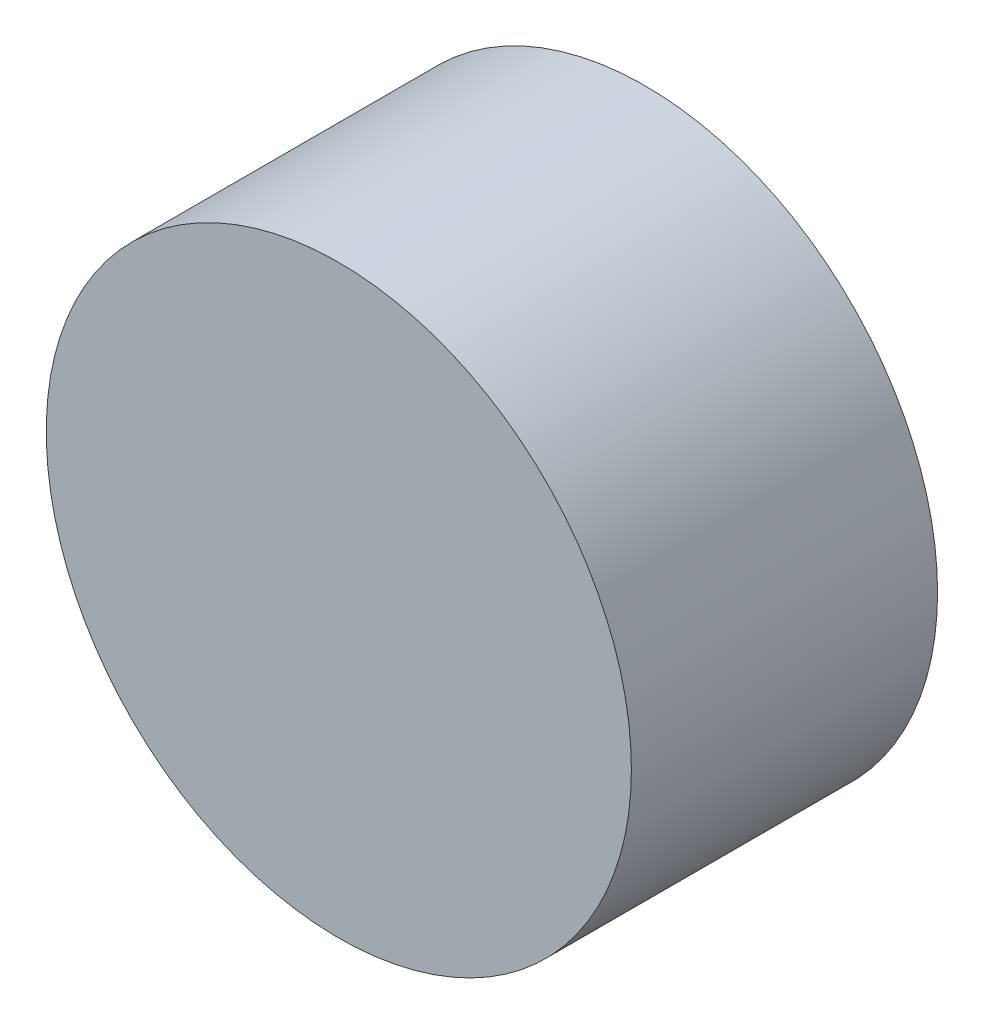
ISO-10303-21;
HEADER;
FILE_DESCRIPTION(('STEP AP214'),'2;1');
FILE_NAME('part.step','',(''),(''),'','','');
FILE_SCHEMA(('AUTOMOTIVE_DESIGN { 1 0 10303 214 1 1 1 1 }'));
ENDSEC;
DATA;
#1=APPLICATION_CONTEXT('core data for automotive mechanical design processes');
#2=APPLICATION_PROTOCOL_DEFINITION('international standard','automotive_design',2000,#1);
#3=PRODUCT_CONTEXT('',#1,'mechanical');
#4=PRODUCT('Part','Part','',(#3));
#5=PRODUCT_RELATED_PRODUCT_CATEGORY('part','',(#4));
#6=PRODUCT_DEFINITION_FORMATION('','',#4);
#7=PRODUCT_DEFINITION_CONTEXT('part definition',#1,'design');
#8=PRODUCT_DEFINITION('design','',#6,#7);
#9=PRODUCT_DEFINITION_SHAPE('','',#8);
#10=(LENGTH_UNIT() NAMED_UNIT(*) SI_UNIT(.MILLI.,.METRE.));
#11=(NAMED_UNIT(*) PLANE_ANGLE_UNIT() SI_UNIT($,.RADIAN.));
#12=(NAMED_UNIT(*) SI_UNIT($,.STERADIAN.) SOLID_ANGLE_UNIT());
#13=UNCERTAINTY_MEASURE_WITH_UNIT(LENGTH_MEASURE(1.E-05),#10,'distance_accuracy_value','');
#14=(GEOMETRIC_REPRESENTATION_CONTEXT(3) GLOBAL_UNCERTAINTY_ASSIGNED_CONTEXT((#13)) GLOBAL_UNIT_ASSIGNED_CONTEXT((#10,
#11,#12)) REPRESENTATION_CONTEXT('',''));
#15=CARTESIAN_POINT('',(0.,0.,0.));
#16=DIRECTION('',(0.,0.,1.));
#17=DIRECTION('',(1.,0.,0.));
#18=AXIS2_PLACEMENT_3D('',#15,#16,#17);
#19=CARTESIAN_POINT('',(0.,0.,40.));
#20=DIRECTION('',(0.,0.,1.));
#21=DIRECTION('',(1.,0.,0.));
#22=AXIS2_PLACEMENT_3D('',#19,#20,#21);
#23=PLANE('',#22);
#24=CARTESIAN_POINT('',(0.,0.,40.));
#25=DIRECTION('',(0.,0.,1.));
#26=DIRECTION('',(1.,0.,0.));
#27=AXIS2_PLACEMENT_3D('',#24,#25,#26);
#28=CIRCLE('',#27,27.5);
#29=CARTESIAN_POINT('',(27.5,0.,40.));
#30=VERTEX_POINT('',#29);
#31=EDGE_CURVE('E228',#30,#30,#28,.T.);
#32=ORIENTED_EDGE('',*,*,#31,.F.);
#33=EDGE_LOOP('',(#32));
#34=FACE_BOUND('',#33,.T.);
#35=DIRECTION('',(0.5,0.866025403784439,0.));
#36=VECTOR('',#35,1.);
#37=CARTESIAN_POINT('',(-12.7017059221718,0.,40.));
#38=LINE('',#37,#36);
#39=CARTESIAN_POINT('',(-12.7017059221718,0.,40.));
#40=VERTEX_POINT('',#39);
#41=CARTESIAN_POINT('',(-6.35085296108589,11.,40.));
#42=VERTEX_POINT('',#41);
#43=EDGE_CURVE('E143',#40,#42,#38,.T.);
#44=ORIENTED_EDGE('',*,*,#43,.F.);
#45=DIRECTION('',(-0.5,0.866025403784439,0.));
#46=VECTOR('',#45,1.);
#47=CARTESIAN_POINT('',(-6.35085296108589,-11.,40.));
#48=LINE('',#47,#46);
#49=CARTESIAN_POINT('',(-6.35085296108589,-11.,40.));
#50=VERTEX_POINT('',#49);
#51=EDGE_CURVE('E186',#50,#40,#48,.T.);
#52=ORIENTED_EDGE('',*,*,#51,.F.);
#53=DIRECTION('',(-1.,0.,0.));
#54=VECTOR('',#53,1.);
#55=CARTESIAN_POINT('',(6.35085296108586,-11.,40.));
#56=LINE('',#55,#54);
#57=CARTESIAN_POINT('',(6.35085296108586,-11.,40.));
#58=VERTEX_POINT('',#57);
#59=EDGE_CURVE('E204',#58,#50,#56,.T.);
#60=ORIENTED_EDGE('',*,*,#59,.F.);
#61=DIRECTION('',(-0.5,-0.866025403784438,0.));
#62=VECTOR('',#61,1.);
#63=CARTESIAN_POINT('',(12.7017059221718,0.,40.));
#64=LINE('',#63,#62);
#65=CARTESIAN_POINT('',(12.7017059221718,0.,40.));
#66=VERTEX_POINT('',#65);
#67=EDGE_CURVE('E201',#66,#58,#64,.T.);
#68=ORIENTED_EDGE('',*,*,#67,.F.);
#69=DIRECTION('',(0.5,-0.866025403784439,0.));
#70=VECTOR('',#69,1.);
#71=CARTESIAN_POINT('',(6.35085296108587,11.,40.));
#72=LINE('',#71,#70);
#73=CARTESIAN_POINT('',(6.35085296108587,11.,40.));
#74=VERTEX_POINT('',#73);
#75=EDGE_CURVE('E57',#74,#66,#72,.T.);
#76=ORIENTED_EDGE('',*,*,#75,.F.);
#77=DIRECTION('',(1.,0.,0.));
#78=VECTOR('',#77,1.);
#79=CARTESIAN_POINT('',(-6.35085296108589,11.,40.));
#80=LINE('',#79,#78);
#81=EDGE_CURVE('E52',#42,#74,#80,.T.);
#82=ORIENTED_EDGE('',*,*,#81,.F.);
#83=EDGE_LOOP('',(#44,#52,#60,#68,#76,#82));
#84=FACE_BOUND('',#83,.T.);
#85=ADVANCED_FACE('F37',(#34,#84),#23,.F.);
#86=CARTESIAN_POINT('',(0.,0.,0.));
#87=DIRECTION('',(0.,0.,1.));
#88=DIRECTION('',(1.,0.,0.));
#89=AXIS2_PLACEMENT_3D('',#86,#87,#88);
#90=PLANE('',#89);
#91=CARTESIAN_POINT('',(0.,0.,0.));
#92=DIRECTION('',(0.,0.,1.));
#93=DIRECTION('',(1.,0.,0.));
#94=AXIS2_PLACEMENT_3D('',#91,#92,#93);
#95=CIRCLE('',#94,43.);
#96=CARTESIAN_POINT('',(43.,0.,0.));
#97=VERTEX_POINT('',#96);
#98=EDGE_CURVE('E11',#97,#97,#95,.T.);
#99=ORIENTED_EDGE('',*,*,#98,.F.);
#100=EDGE_LOOP('',(#99));
#101=FACE_BOUND('',#100,.T.);
#102=CARTESIAN_POINT('',(0.,0.,0.));
#103=DIRECTION('',(0.,0.,1.));
#104=DIRECTION('',(1.,0.,0.));
#105=AXIS2_PLACEMENT_3D('',#102,#103,#104);
#106=CIRCLE('',#105,27.5);
#107=CARTESIAN_POINT('',(27.5,0.,0.));
#108=VERTEX_POINT('',#107);
#109=EDGE_CURVE('E45',#108,#108,#106,.T.);
#110=ORIENTED_EDGE('',*,*,#109,.T.);
#111=EDGE_LOOP('',(#110));
#112=FACE_BOUND('',#111,.T.);
#113=ADVANCED_FACE('F233',(#101,#112),#90,.F.);
#114=CARTESIAN_POINT('',(0.,0.,40.));
#115=DIRECTION('',(0.,0.,-1.));
#116=DIRECTION('',(-1.,0.,0.));
#117=AXIS2_PLACEMENT_3D('',#114,#115,#116);
#118=CYLINDRICAL_SURFACE('',#117,43.);
#119=ORIENTED_EDGE('',*,*,#98,.T.);
#120=EDGE_LOOP('',(#119));
#121=FACE_BOUND('',#120,.T.);
#122=CARTESIAN_POINT('',(0.,0.,45.));
#123=DIRECTION('',(0.,0.,1.));
#124=DIRECTION('',(1.,0.,0.));
#125=AXIS2_PLACEMENT_3D('',#122,#123,#124);
#126=CIRCLE('',#125,43.);
#127=CARTESIAN_POINT('',(43.,0.,45.));
#128=VERTEX_POINT('',#127);
#129=EDGE_CURVE('E225',#128,#128,#126,.T.);
#130=ORIENTED_EDGE('',*,*,#129,.F.);
#131=EDGE_LOOP('',(#130));
#132=FACE_BOUND('',#131,.T.);
#133=ADVANCED_FACE('F39',(#121,#132),#118,.T.);
#134=CARTESIAN_POINT('',(0.,0.,40.));
#135=DIRECTION('',(0.,0.,-1.));
#136=DIRECTION('',(-1.,0.,0.));
#137=AXIS2_PLACEMENT_3D('',#134,#135,#136);
#138=CYLINDRICAL_SURFACE('',#137,27.5);
#139=ORIENTED_EDGE('',*,*,#31,.T.);
#140=EDGE_LOOP('',(#139));
#141=FACE_BOUND('',#140,.T.);
#142=ORIENTED_EDGE('',*,*,#109,.F.);
#143=EDGE_LOOP('',(#142));
#144=FACE_BOUND('',#143,.T.);
#145=ADVANCED_FACE('F235',(#141,#144),#138,.F.);
#146=CARTESIAN_POINT('',(0.,0.,45.));
#147=DIRECTION('',(0.,0.,1.));
#148=DIRECTION('',(1.,0.,0.));
#149=AXIS2_PLACEMENT_3D('',#146,#147,#148);
#150=PLANE('',#149);
#151=ORIENTED_EDGE('',*,*,#129,.T.);
#152=EDGE_LOOP('',(#151));
#153=FACE_BOUND('',#152,.T.);
#154=ADVANCED_FACE('F237',(#153),#150,.T.);
#155=CARTESIAN_POINT('',(0.,0.,30.));
#156=DIRECTION('',(0.,0.,-1.));
#157=DIRECTION('',(-1.,0.,0.));
#158=AXIS2_PLACEMENT_3D('',#155,#156,#157);
#159=PLANE('',#158);
#160=DIRECTION('',(0.5,0.866025403784439,0.));
#161=VECTOR('',#160,1.);
#162=CARTESIAN_POINT('',(-12.7017059221718,0.,30.));
#163=LINE('',#162,#161);
#164=CARTESIAN_POINT('',(-12.7017059221718,0.,30.));
#165=VERTEX_POINT('',#164);
#166=CARTESIAN_POINT('',(-6.35085296108589,11.,30.));
#167=VERTEX_POINT('',#166);
#168=EDGE_CURVE('E182',#165,#167,#163,.T.);
#169=ORIENTED_EDGE('',*,*,#168,.T.);
#170=DIRECTION('',(1.,0.,0.));
#171=VECTOR('',#170,1.);
#172=CARTESIAN_POINT('',(-6.35085296108589,11.,30.));
#173=LINE('',#172,#171);
#174=CARTESIAN_POINT('',(6.35085296108587,11.,30.));
#175=VERTEX_POINT('',#174);
#176=EDGE_CURVE('E185',#167,#175,#173,.T.);
#177=ORIENTED_EDGE('',*,*,#176,.T.);
#178=DIRECTION('',(0.5,-0.866025403784439,0.));
#179=VECTOR('',#178,1.);
#180=CARTESIAN_POINT('',(6.35085296108587,11.,30.));
#181=LINE('',#180,#179);
#182=CARTESIAN_POINT('',(12.7017059221718,0.,30.));
#183=VERTEX_POINT('',#182);
#184=EDGE_CURVE('E188',#175,#183,#181,.T.);
#185=ORIENTED_EDGE('',*,*,#184,.T.);
#186=DIRECTION('',(-0.5,-0.866025403784438,0.));
#187=VECTOR('',#186,1.);
#188=CARTESIAN_POINT('',(12.7017059221718,0.,30.));
#189=LINE('',#188,#187);
#190=CARTESIAN_POINT('',(6.35085296108586,-11.,30.));
#191=VERTEX_POINT('',#190);
#192=EDGE_CURVE('E190',#183,#191,#189,.T.);
#193=ORIENTED_EDGE('',*,*,#192,.T.);
#194=DIRECTION('',(-1.,0.,0.));
#195=VECTOR('',#194,1.);
#196=CARTESIAN_POINT('',(6.35085296108586,-11.,30.));
#197=LINE('',#196,#195);
#198=CARTESIAN_POINT('',(-6.35085296108589,-11.,30.));
#199=VERTEX_POINT('',#198);
#200=EDGE_CURVE('E192',#191,#199,#197,.T.);
#201=ORIENTED_EDGE('',*,*,#200,.T.);
#202=DIRECTION('',(-0.5,0.866025403784439,0.));
#203=VECTOR('',#202,1.);
#204=CARTESIAN_POINT('',(-6.35085296108589,-11.,30.));
#205=LINE('',#204,#203);
#206=EDGE_CURVE('E194',#199,#165,#205,.T.);
#207=ORIENTED_EDGE('',*,*,#206,.T.);
#208=EDGE_LOOP('',(#169,#177,#185,#193,#201,#207));
#209=FACE_BOUND('',#208,.T.);
#210=DIRECTION('',(1.,0.,0.));
#211=VECTOR('',#210,1.);
#212=CARTESIAN_POINT('',(-3.46410161513775,6.,30.));
#213=LINE('',#212,#211);
#214=CARTESIAN_POINT('',(-3.46410161513775,6.,30.));
#215=VERTEX_POINT('',#214);
#216=CARTESIAN_POINT('',(3.46410161513776,6.,30.));
#217=VERTEX_POINT('',#216);
#218=EDGE_CURVE('E135',#215,#217,#213,.T.);
#219=ORIENTED_EDGE('',*,*,#218,.F.);
#220=DIRECTION('',(0.5,0.866025403784438,0.));
#221=VECTOR('',#220,1.);
#222=CARTESIAN_POINT('',(-6.92820323027551,0.,30.));
#223=LINE('',#222,#221);
#224=CARTESIAN_POINT('',(-6.92820323027551,0.,30.));
#225=VERTEX_POINT('',#224);
#226=EDGE_CURVE('E125',#225,#215,#223,.T.);
#227=ORIENTED_EDGE('',*,*,#226,.F.);
#228=DIRECTION('',(-0.5,0.866025403784439,0.));
#229=VECTOR('',#228,1.);
#230=CARTESIAN_POINT('',(-3.46410161513775,-6.,30.));
#231=LINE('',#230,#229);
#232=CARTESIAN_POINT('',(-3.46410161513775,-6.,30.));
#233=VERTEX_POINT('',#232);
#234=EDGE_CURVE('E158',#233,#225,#231,.T.);
#235=ORIENTED_EDGE('',*,*,#234,.F.);
#236=DIRECTION('',(-1.,0.,0.));
#237=VECTOR('',#236,1.);
#238=CARTESIAN_POINT('',(3.46410161513776,-6.,30.));
#239=LINE('',#238,#237);
#240=CARTESIAN_POINT('',(3.46410161513776,-6.,30.));
#241=VERTEX_POINT('',#240);
#242=EDGE_CURVE('E155',#241,#233,#239,.T.);
#243=ORIENTED_EDGE('',*,*,#242,.F.);
#244=DIRECTION('',(-0.5,-0.866025403784438,0.));
#245=VECTOR('',#244,1.);
#246=CARTESIAN_POINT('',(6.92820323027551,0.,30.));
#247=LINE('',#246,#245);
#248=CARTESIAN_POINT('',(6.92820323027551,0.,30.));
#249=VERTEX_POINT('',#248);
#250=EDGE_CURVE('E151',#249,#241,#247,.T.);
#251=ORIENTED_EDGE('',*,*,#250,.F.);
#252=DIRECTION('',(0.5,-0.866025403784439,0.));
#253=VECTOR('',#252,1.);
#254=CARTESIAN_POINT('',(3.46410161513776,6.,30.));
#255=LINE('',#254,#253);
#256=EDGE_CURVE('E149',#217,#249,#255,.T.);
#257=ORIENTED_EDGE('',*,*,#256,.F.);
#258=EDGE_LOOP('',(#219,#227,#235,#243,#251,#257));
#259=FACE_BOUND('',#258,.T.);
#260=ADVANCED_FACE('F147',(#209,#259),#159,.T.);
#261=CARTESIAN_POINT('',(-12.7017059221718,0.,30.));
#262=DIRECTION('',(0.866025403784439,-0.5,0.));
#263=DIRECTION('',(0.5,0.866025403784439,0.));
#264=AXIS2_PLACEMENT_3D('',#261,#262,#263);
#265=PLANE('',#264);
#266=ORIENTED_EDGE('',*,*,#43,.T.);
#267=DIRECTION('',(0.,0.,1.));
#268=VECTOR('',#267,1.);
#269=CARTESIAN_POINT('',(-6.35085296108589,11.,30.));
#270=LINE('',#269,#268);
#271=EDGE_CURVE('E223',#167,#42,#270,.T.);
#272=ORIENTED_EDGE('',*,*,#271,.F.);
#273=ORIENTED_EDGE('',*,*,#168,.F.);
#274=DIRECTION('',(0.,0.,1.));
#275=VECTOR('',#274,1.);
#276=CARTESIAN_POINT('',(-12.7017059221718,0.,30.));
#277=LINE('',#276,#275);
#278=EDGE_CURVE('E196',#165,#40,#277,.T.);
#279=ORIENTED_EDGE('',*,*,#278,.T.);
#280=EDGE_LOOP('',(#266,#272,#273,#279));
#281=FACE_BOUND('',#280,.T.);
#282=ADVANCED_FACE('F292',(#281),#265,.F.);
#283=CARTESIAN_POINT('',(-6.35085296108589,11.,30.));
#284=DIRECTION('',(0.,-1.,0.));
#285=DIRECTION('',(1.,0.,0.));
#286=AXIS2_PLACEMENT_3D('',#283,#284,#285);
#287=PLANE('',#286);
#288=ORIENTED_EDGE('',*,*,#81,.T.);
#289=DIRECTION('',(0.,0.,1.));
#290=VECTOR('',#289,1.);
#291=CARTESIAN_POINT('',(6.35085296108587,11.,30.));
#292=LINE('',#291,#290);
#293=EDGE_CURVE('E220',#175,#74,#292,.T.);
#294=ORIENTED_EDGE('',*,*,#293,.F.);
#295=ORIENTED_EDGE('',*,*,#176,.F.);
#296=ORIENTED_EDGE('',*,*,#271,.T.);
#297=EDGE_LOOP('',(#288,#294,#295,#296));
#298=FACE_BOUND('',#297,.T.);
#299=ADVANCED_FACE('F308',(#298),#287,.F.);
#300=CARTESIAN_POINT('',(6.35085296108587,11.,30.));
#301=DIRECTION('',(-0.866025403784439,-0.5,0.));
#302=DIRECTION('',(0.5,-0.866025403784439,0.));
#303=AXIS2_PLACEMENT_3D('',#300,#301,#302);
#304=PLANE('',#303);
#305=ORIENTED_EDGE('',*,*,#75,.T.);
#306=DIRECTION('',(0.,0.,1.));
#307=VECTOR('',#306,1.);
#308=CARTESIAN_POINT('',(12.7017059221718,0.,30.));
#309=LINE('',#308,#307);
#310=EDGE_CURVE('E217',#183,#66,#309,.T.);
#311=ORIENTED_EDGE('',*,*,#310,.F.);
#312=ORIENTED_EDGE('',*,*,#184,.F.);
#313=ORIENTED_EDGE('',*,*,#293,.T.);
#314=EDGE_LOOP('',(#305,#311,#312,#313));
#315=FACE_BOUND('',#314,.T.);
#316=ADVANCED_FACE('F304',(#315),#304,.F.);
#317=CARTESIAN_POINT('',(12.7017059221718,0.,30.));
#318=DIRECTION('',(-0.866025403784439,0.5,0.));
#319=DIRECTION('',(-0.5,-0.866025403784439,0.));
#320=AXIS2_PLACEMENT_3D('',#317,#318,#319);
#321=PLANE('',#320);
#322=ORIENTED_EDGE('',*,*,#67,.T.);
#323=DIRECTION('',(0.,0.,1.));
#324=VECTOR('',#323,1.);
#325=CARTESIAN_POINT('',(6.35085296108586,-11.,30.));
#326=LINE('',#325,#324);
#327=EDGE_CURVE('E214',#191,#58,#326,.T.);
#328=ORIENTED_EDGE('',*,*,#327,.F.);
#329=ORIENTED_EDGE('',*,*,#192,.F.);
#330=ORIENTED_EDGE('',*,*,#310,.T.);
#331=EDGE_LOOP('',(#322,#328,#329,#330));
#332=FACE_BOUND('',#331,.T.);
#333=ADVANCED_FACE('F300',(#332),#321,.F.);
#334=CARTESIAN_POINT('',(6.35085296108586,-11.,30.));
#335=DIRECTION('',(0.,1.,0.));
#336=DIRECTION('',(0.,0.,1.));
#337=AXIS2_PLACEMENT_3D('',#334,#335,#336);
#338=PLANE('',#337);
#339=ORIENTED_EDGE('',*,*,#59,.T.);
#340=DIRECTION('',(0.,0.,1.));
#341=VECTOR('',#340,1.);
#342=CARTESIAN_POINT('',(-6.35085296108589,-11.,30.));
#343=LINE('',#342,#341);
#344=EDGE_CURVE('E211',#199,#50,#343,.T.);
#345=ORIENTED_EDGE('',*,*,#344,.F.);
#346=ORIENTED_EDGE('',*,*,#200,.F.);
#347=ORIENTED_EDGE('',*,*,#327,.T.);
#348=EDGE_LOOP('',(#339,#345,#346,#347));
#349=FACE_BOUND('',#348,.T.);
#350=ADVANCED_FACE('F296',(#349),#338,.F.);
#351=CARTESIAN_POINT('',(-6.35085296108589,-11.,30.));
#352=DIRECTION('',(0.866025403784439,0.5,0.));
#353=DIRECTION('',(-0.5,0.866025403784439,0.));
#354=AXIS2_PLACEMENT_3D('',#351,#352,#353);
#355=PLANE('',#354);
#356=ORIENTED_EDGE('',*,*,#51,.T.);
#357=ORIENTED_EDGE('',*,*,#278,.F.);
#358=ORIENTED_EDGE('',*,*,#206,.F.);
#359=ORIENTED_EDGE('',*,*,#344,.T.);
#360=EDGE_LOOP('',(#356,#357,#358,#359));
#361=FACE_BOUND('',#360,.T.);
#362=ADVANCED_FACE('F289',(#361),#355,.F.);
#363=CARTESIAN_POINT('',(-6.92820323027551,0.,30.));
#364=DIRECTION('',(0.866025403784438,-0.5,0.));
#365=DIRECTION('',(0.5,0.866025403784438,0.));
#366=AXIS2_PLACEMENT_3D('',#363,#364,#365);
#367=PLANE('',#366);
#368=DIRECTION('',(0.5,0.866025403784438,0.));
#369=VECTOR('',#368,1.);
#370=CARTESIAN_POINT('',(-6.92820323027551,0.,40.));
#371=LINE('',#370,#369);
#372=CARTESIAN_POINT('',(-6.92820323027551,0.,40.));
#373=VERTEX_POINT('',#372);
#374=CARTESIAN_POINT('',(-3.46410161513775,6.,40.));
#375=VERTEX_POINT('',#374);
#376=EDGE_CURVE('E160',#373,#375,#371,.T.);
#377=ORIENTED_EDGE('',*,*,#376,.F.);
#378=DIRECTION('',(0.,0.,1.));
#379=VECTOR('',#378,1.);
#380=CARTESIAN_POINT('',(-6.92820323027551,0.,30.));
#381=LINE('',#380,#379);
#382=EDGE_CURVE('E131',#225,#373,#381,.T.);
#383=ORIENTED_EDGE('',*,*,#382,.F.);
#384=ORIENTED_EDGE('',*,*,#226,.T.);
#385=DIRECTION('',(0.,0.,1.));
#386=VECTOR('',#385,1.);
#387=CARTESIAN_POINT('',(-3.46410161513775,6.,30.));
#388=LINE('',#387,#386);
#389=EDGE_CURVE('E129',#215,#375,#388,.T.);
#390=ORIENTED_EDGE('',*,*,#389,.T.);
#391=EDGE_LOOP('',(#377,#383,#384,#390));
#392=FACE_BOUND('',#391,.T.);
#393=ADVANCED_FACE('F128',(#392),#367,.T.);
#394=CARTESIAN_POINT('',(-3.46410161513775,6.,30.));
#395=DIRECTION('',(0.,-1.,0.));
#396=DIRECTION('',(0.,0.,-1.));
#397=AXIS2_PLACEMENT_3D('',#394,#395,#396);
#398=PLANE('',#397);
#399=DIRECTION('',(1.,0.,0.));
#400=VECTOR('',#399,1.);
#401=CARTESIAN_POINT('',(-3.46410161513775,6.,40.));
#402=LINE('',#401,#400);
#403=CARTESIAN_POINT('',(3.46410161513776,6.,40.));
#404=VERTEX_POINT('',#403);
#405=EDGE_CURVE('E142',#375,#404,#402,.T.);
#406=ORIENTED_EDGE('',*,*,#405,.F.);
#407=ORIENTED_EDGE('',*,*,#389,.F.);
#408=ORIENTED_EDGE('',*,*,#218,.T.);
#409=DIRECTION('',(0.,0.,1.));
#410=VECTOR('',#409,1.);
#411=CARTESIAN_POINT('',(3.46410161513776,6.,30.));
#412=LINE('',#411,#410);
#413=EDGE_CURVE('E144',#217,#404,#412,.T.);
#414=ORIENTED_EDGE('',*,*,#413,.T.);
#415=EDGE_LOOP('',(#406,#407,#408,#414));
#416=FACE_BOUND('',#415,.T.);
#417=ADVANCED_FACE('F139',(#416),#398,.T.);
#418=CARTESIAN_POINT('',(3.46410161513776,6.,30.));
#419=DIRECTION('',(-0.866025403784439,-0.5,0.));
#420=DIRECTION('',(0.5,-0.866025403784439,0.));
#421=AXIS2_PLACEMENT_3D('',#418,#419,#420);
#422=PLANE('',#421);
#423=DIRECTION('',(0.5,-0.866025403784439,0.));
#424=VECTOR('',#423,1.);
#425=CARTESIAN_POINT('',(3.46410161513776,6.,40.));
#426=LINE('',#425,#424);
#427=CARTESIAN_POINT('',(6.92820323027551,0.,40.));
#428=VERTEX_POINT('',#427);
#429=EDGE_CURVE('E163',#404,#428,#426,.T.);
#430=ORIENTED_EDGE('',*,*,#429,.F.);
#431=ORIENTED_EDGE('',*,*,#413,.F.);
#432=ORIENTED_EDGE('',*,*,#256,.T.);
#433=DIRECTION('',(0.,0.,1.));
#434=VECTOR('',#433,1.);
#435=CARTESIAN_POINT('',(6.92820323027551,0.,30.));
#436=LINE('',#435,#434);
#437=EDGE_CURVE('E179',#249,#428,#436,.T.);
#438=ORIENTED_EDGE('',*,*,#437,.T.);
#439=EDGE_LOOP('',(#430,#431,#432,#438));
#440=FACE_BOUND('',#439,.T.);
#441=ADVANCED_FACE('F276',(#440),#422,.T.);
#442=CARTESIAN_POINT('',(6.92820323027551,0.,30.));
#443=DIRECTION('',(-0.866025403784438,0.5,0.));
#444=DIRECTION('',(-0.5,-0.866025403784439,0.));
#445=AXIS2_PLACEMENT_3D('',#442,#443,#444);
#446=PLANE('',#445);
#447=DIRECTION('',(-0.5,-0.866025403784438,0.));
#448=VECTOR('',#447,1.);
#449=CARTESIAN_POINT('',(6.92820323027551,0.,40.));
#450=LINE('',#449,#448);
#451=CARTESIAN_POINT('',(3.46410161513776,-6.,40.));
#452=VERTEX_POINT('',#451);
#453=EDGE_CURVE('E166',#428,#452,#450,.T.);
#454=ORIENTED_EDGE('',*,*,#453,.F.);
#455=ORIENTED_EDGE('',*,*,#437,.F.);
#456=ORIENTED_EDGE('',*,*,#250,.T.);
#457=DIRECTION('',(0.,0.,1.));
#458=VECTOR('',#457,1.);
#459=CARTESIAN_POINT('',(3.46410161513776,-6.,30.));
#460=LINE('',#459,#458);
#461=EDGE_CURVE('E177',#241,#452,#460,.T.);
#462=ORIENTED_EDGE('',*,*,#461,.T.);
#463=EDGE_LOOP('',(#454,#455,#456,#462));
#464=FACE_BOUND('',#463,.T.);
#465=ADVANCED_FACE('F272',(#464),#446,.T.);
#466=CARTESIAN_POINT('',(3.46410161513776,-6.,30.));
#467=DIRECTION('',(0.,1.,0.));
#468=DIRECTION('',(0.,0.,1.));
#469=AXIS2_PLACEMENT_3D('',#466,#467,#468);
#470=PLANE('',#469);
#471=DIRECTION('',(-1.,0.,0.));
#472=VECTOR('',#471,1.);
#473=CARTESIAN_POINT('',(3.46410161513776,-6.,40.));
#474=LINE('',#473,#472);
#475=CARTESIAN_POINT('',(-3.46410161513775,-6.,40.));
#476=VERTEX_POINT('',#475);
#477=EDGE_CURVE('E169',#452,#476,#474,.T.);
#478=ORIENTED_EDGE('',*,*,#477,.F.);
#479=ORIENTED_EDGE('',*,*,#461,.F.);
#480=ORIENTED_EDGE('',*,*,#242,.T.);
#481=DIRECTION('',(0.,0.,1.));
#482=VECTOR('',#481,1.);
#483=CARTESIAN_POINT('',(-3.46410161513775,-6.,30.));
#484=LINE('',#483,#482);
#485=EDGE_CURVE('E175',#233,#476,#484,.T.);
#486=ORIENTED_EDGE('',*,*,#485,.T.);
#487=EDGE_LOOP('',(#478,#479,#480,#486));
#488=FACE_BOUND('',#487,.T.);
#489=ADVANCED_FACE('F262',(#488),#470,.T.);
#490=CARTESIAN_POINT('',(-3.46410161513775,-6.,30.));
#491=DIRECTION('',(0.866025403784439,0.5,0.));
#492=DIRECTION('',(-0.5,0.866025403784439,0.));
#493=AXIS2_PLACEMENT_3D('',#490,#491,#492);
#494=PLANE('',#493);
#495=DIRECTION('',(-0.5,0.866025403784439,0.));
#496=VECTOR('',#495,1.);
#497=CARTESIAN_POINT('',(-3.46410161513775,-6.,40.));
#498=LINE('',#497,#496);
#499=EDGE_CURVE('E136',#476,#373,#498,.T.);
#500=ORIENTED_EDGE('',*,*,#499,.F.);
#501=ORIENTED_EDGE('',*,*,#485,.F.);
#502=ORIENTED_EDGE('',*,*,#234,.T.);
#503=ORIENTED_EDGE('',*,*,#382,.T.);
#504=EDGE_LOOP('',(#500,#501,#502,#503));
#505=FACE_BOUND('',#504,.T.);
#506=ADVANCED_FACE('F257',(#505),#494,.T.);
#507=ORIENTED_EDGE('',*,*,#499,.T.);
#508=ORIENTED_EDGE('',*,*,#376,.T.);
#509=ORIENTED_EDGE('',*,*,#405,.T.);
#510=ORIENTED_EDGE('',*,*,#429,.T.);
#511=ORIENTED_EDGE('',*,*,#453,.T.);
#512=ORIENTED_EDGE('',*,*,#477,.T.);
#513=EDGE_LOOP('',(#507,#508,#509,#510,#511,#512));
#514=FACE_BOUND('',#513,.T.);
#515=ADVANCED_FACE('F250',(#514),#23,.F.);
#516=CLOSED_SHELL('',(#85,#113,#133,#145,#154,#260,#282,#299,#316,#333,#350,#362,#393,#417,#441,
#465,#489,#506,#515));
#517=MANIFOLD_SOLID_BREP('B2',#516);
#518=ADVANCED_BREP_SHAPE_REPRESENTATION('',(#18,#517),#14);
#519=SHAPE_DEFINITION_REPRESENTATION(#9,#518);
ENDSEC;
END-ISO-10303-21;
